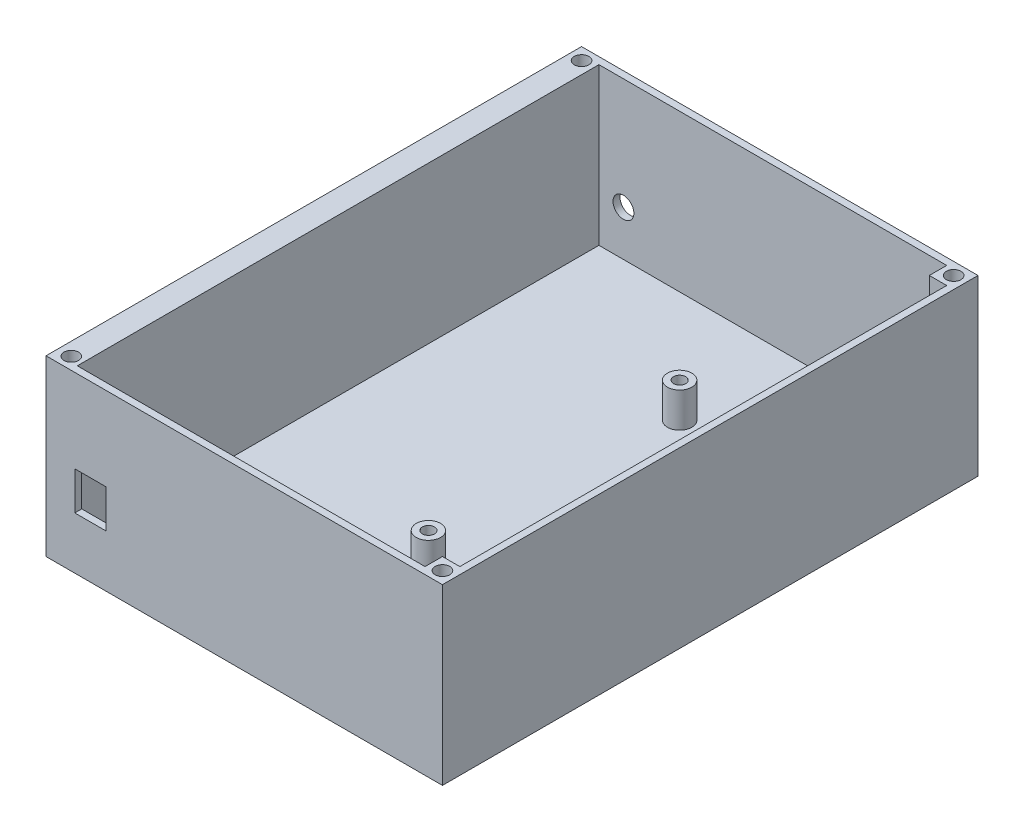
ISO-10303-21;
HEADER;
FILE_DESCRIPTION(('STEP AP214'),'2;1');
FILE_NAME('part.step','',(''),(''),'','','');
FILE_SCHEMA(('AUTOMOTIVE_DESIGN { 1 0 10303 214 1 1 1 1 }'));
ENDSEC;
DATA;
#1=APPLICATION_CONTEXT('core data for automotive mechanical design processes');
#2=APPLICATION_PROTOCOL_DEFINITION('international standard','automotive_design',2000,#1);
#3=PRODUCT_CONTEXT('',#1,'mechanical');
#4=PRODUCT('Part','Part','',(#3));
#5=PRODUCT_RELATED_PRODUCT_CATEGORY('part','',(#4));
#6=PRODUCT_DEFINITION_FORMATION('','',#4);
#7=PRODUCT_DEFINITION_CONTEXT('part definition',#1,'design');
#8=PRODUCT_DEFINITION('design','',#6,#7);
#9=PRODUCT_DEFINITION_SHAPE('','',#8);
#10=(LENGTH_UNIT() NAMED_UNIT(*) SI_UNIT(.MILLI.,.METRE.));
#11=(NAMED_UNIT(*) PLANE_ANGLE_UNIT() SI_UNIT($,.RADIAN.));
#12=(NAMED_UNIT(*) SI_UNIT($,.STERADIAN.) SOLID_ANGLE_UNIT());
#13=UNCERTAINTY_MEASURE_WITH_UNIT(LENGTH_MEASURE(1.E-05),#10,'distance_accuracy_value','');
#14=(GEOMETRIC_REPRESENTATION_CONTEXT(3) GLOBAL_UNCERTAINTY_ASSIGNED_CONTEXT((#13)) GLOBAL_UNIT_ASSIGNED_CONTEXT((#10,
#11,#12)) REPRESENTATION_CONTEXT('',''));
#15=CARTESIAN_POINT('',(0.,0.,0.));
#16=DIRECTION('',(0.,0.,1.));
#17=DIRECTION('',(1.,0.,0.));
#18=AXIS2_PLACEMENT_3D('',#15,#16,#17);
#19=CARTESIAN_POINT('',(50.,5.,-75.));
#20=DIRECTION('',(1.,0.,0.));
#21=DIRECTION('',(0.,0.,-1.));
#22=AXIS2_PLACEMENT_3D('',#19,#20,#21);
#23=PLANE('',#22);
#24=DIRECTION('',(0.,0.,-1.));
#25=VECTOR('',#24,1.);
#26=CARTESIAN_POINT('',(50.,5.,-75.));
#27=LINE('',#26,#25);
#28=CARTESIAN_POINT('',(50.,5.,-70.));
#29=VERTEX_POINT('',#28);
#30=CARTESIAN_POINT('',(50.,5.,-75.));
#31=VERTEX_POINT('',#30);
#32=EDGE_CURVE('E337',#29,#31,#27,.T.);
#33=ORIENTED_EDGE('',*,*,#32,.F.);
#34=DIRECTION('',(0.,1.,0.));
#35=VECTOR('',#34,1.);
#36=CARTESIAN_POINT('',(50.,5.,-70.));
#37=LINE('',#36,#35);
#38=CARTESIAN_POINT('',(50.,50.,-70.));
#39=VERTEX_POINT('',#38);
#40=EDGE_CURVE('E254',#29,#39,#37,.T.);
#41=ORIENTED_EDGE('',*,*,#40,.T.);
#42=DIRECTION('',(0.,0.,-1.));
#43=VECTOR('',#42,1.);
#44=CARTESIAN_POINT('',(50.,50.,-75.));
#45=LINE('',#44,#43);
#46=CARTESIAN_POINT('',(50.,50.,-75.));
#47=VERTEX_POINT('',#46);
#48=EDGE_CURVE('E353',#39,#47,#45,.T.);
#49=ORIENTED_EDGE('',*,*,#48,.T.);
#50=DIRECTION('',(0.,1.,0.));
#51=VECTOR('',#50,1.);
#52=CARTESIAN_POINT('',(50.,5.,-75.));
#53=LINE('',#52,#51);
#54=EDGE_CURVE('E365',#31,#47,#53,.T.);
#55=ORIENTED_EDGE('',*,*,#54,.F.);
#56=EDGE_LOOP('',(#33,#41,#49,#55));
#57=FACE_BOUND('',#56,.T.);
#58=ADVANCED_FACE('F41',(#57),#23,.F.);
#59=CARTESIAN_POINT('',(57.,50.,82.));
#60=DIRECTION('',(-1.,0.,0.));
#61=DIRECTION('',(0.,0.,1.));
#62=AXIS2_PLACEMENT_3D('',#59,#60,#61);
#63=PLANE('',#62);
#64=DIRECTION('',(0.,0.,-1.));
#65=VECTOR('',#64,1.);
#66=CARTESIAN_POINT('',(57.,0.,82.));
#67=LINE('',#66,#65);
#68=CARTESIAN_POINT('',(57.,0.,77.));
#69=VERTEX_POINT('',#68);
#70=CARTESIAN_POINT('',(57.,0.,-77.));
#71=VERTEX_POINT('',#70);
#72=EDGE_CURVE('E364',#69,#71,#67,.T.);
#73=ORIENTED_EDGE('',*,*,#72,.T.);
#74=DIRECTION('',(0.,1.,0.));
#75=VECTOR('',#74,1.);
#76=CARTESIAN_POINT('',(57.,0.,-77.));
#77=LINE('',#76,#75);
#78=CARTESIAN_POINT('',(57.,50.,-77.));
#79=VERTEX_POINT('',#78);
#80=EDGE_CURVE('E306',#71,#79,#77,.T.);
#81=ORIENTED_EDGE('',*,*,#80,.T.);
#82=DIRECTION('',(0.,0.,-1.));
#83=VECTOR('',#82,1.);
#84=CARTESIAN_POINT('',(57.,50.,82.));
#85=LINE('',#84,#83);
#86=CARTESIAN_POINT('',(57.,50.,77.));
#87=VERTEX_POINT('',#86);
#88=EDGE_CURVE('E375',#87,#79,#85,.T.);
#89=ORIENTED_EDGE('',*,*,#88,.F.);
#90=DIRECTION('',(0.,1.,0.));
#91=VECTOR('',#90,1.);
#92=CARTESIAN_POINT('',(57.,0.,77.));
#93=LINE('',#92,#91);
#94=EDGE_CURVE('E317',#69,#87,#93,.T.);
#95=ORIENTED_EDGE('',*,*,#94,.F.);
#96=EDGE_LOOP('',(#73,#81,#89,#95));
#97=FACE_BOUND('',#96,.T.);
#98=ADVANCED_FACE('F43',(#97),#63,.F.);
#99=CARTESIAN_POINT('',(-57.,50.,82.));
#100=DIRECTION('',(1.,0.,0.));
#101=DIRECTION('',(0.,0.,-1.));
#102=AXIS2_PLACEMENT_3D('',#99,#100,#101);
#103=PLANE('',#102);
#104=DIRECTION('',(0.,0.,1.));
#105=VECTOR('',#104,1.);
#106=CARTESIAN_POINT('',(-57.,50.,82.));
#107=LINE('',#106,#105);
#108=CARTESIAN_POINT('',(-57.,50.,-77.));
#109=VERTEX_POINT('',#108);
#110=CARTESIAN_POINT('',(-57.,50.,77.));
#111=VERTEX_POINT('',#110);
#112=EDGE_CURVE('E379',#109,#111,#107,.T.);
#113=ORIENTED_EDGE('',*,*,#112,.F.);
#114=DIRECTION('',(0.,1.,0.));
#115=VECTOR('',#114,1.);
#116=CARTESIAN_POINT('',(-57.,0.,-77.));
#117=LINE('',#116,#115);
#118=CARTESIAN_POINT('',(-57.,0.,-77.));
#119=VERTEX_POINT('',#118);
#120=EDGE_CURVE('E303',#119,#109,#117,.T.);
#121=ORIENTED_EDGE('',*,*,#120,.F.);
#122=DIRECTION('',(0.,0.,1.));
#123=VECTOR('',#122,1.);
#124=CARTESIAN_POINT('',(-57.,0.,82.));
#125=LINE('',#124,#123);
#126=CARTESIAN_POINT('',(-57.,0.,77.));
#127=VERTEX_POINT('',#126);
#128=EDGE_CURVE('E380',#119,#127,#125,.T.);
#129=ORIENTED_EDGE('',*,*,#128,.T.);
#130=DIRECTION('',(0.,1.,0.));
#131=VECTOR('',#130,1.);
#132=CARTESIAN_POINT('',(-57.,0.,77.));
#133=LINE('',#132,#131);
#134=EDGE_CURVE('E321',#127,#111,#133,.T.);
#135=ORIENTED_EDGE('',*,*,#134,.T.);
#136=EDGE_LOOP('',(#113,#121,#129,#135));
#137=FACE_BOUND('',#136,.T.);
#138=ADVANCED_FACE('F438',(#137),#103,.F.);
#139=CARTESIAN_POINT('',(0.,50.,0.));
#140=DIRECTION('',(0.,-1.,0.));
#141=DIRECTION('',(0.,0.,-1.));
#142=AXIS2_PLACEMENT_3D('',#139,#140,#141);
#143=PLANE('',#142);
#144=CARTESIAN_POINT('',(53.5,50.,-73.5));
#145=DIRECTION('',(0.,1.,0.));
#146=DIRECTION('',(0.,0.,1.));
#147=AXIS2_PLACEMENT_3D('',#144,#145,#146);
#148=CIRCLE('',#147,2.1);
#149=CARTESIAN_POINT('',(53.5,50.,-71.4));
#150=VERTEX_POINT('',#149);
#151=EDGE_CURVE('E272',#150,#150,#148,.T.);
#152=ORIENTED_EDGE('',*,*,#151,.F.);
#153=EDGE_LOOP('',(#152));
#154=FACE_BOUND('',#153,.T.);
#155=CARTESIAN_POINT('',(-53.5,50.,-73.5));
#156=DIRECTION('',(0.,1.,0.));
#157=DIRECTION('',(0.,0.,1.));
#158=AXIS2_PLACEMENT_3D('',#155,#156,#157);
#159=CIRCLE('',#158,2.1);
#160=CARTESIAN_POINT('',(-53.5,50.,-71.4));
#161=VERTEX_POINT('',#160);
#162=EDGE_CURVE('E258',#161,#161,#159,.T.);
#163=ORIENTED_EDGE('',*,*,#162,.F.);
#164=EDGE_LOOP('',(#163));
#165=FACE_BOUND('',#164,.T.);
#166=CARTESIAN_POINT('',(53.5,50.,73.5));
#167=DIRECTION('',(0.,1.,0.));
#168=DIRECTION('',(0.,0.,1.));
#169=AXIS2_PLACEMENT_3D('',#166,#167,#168);
#170=CIRCLE('',#169,2.1);
#171=CARTESIAN_POINT('',(53.5,50.,75.6));
#172=VERTEX_POINT('',#171);
#173=EDGE_CURVE('E271',#172,#172,#170,.T.);
#174=ORIENTED_EDGE('',*,*,#173,.F.);
#175=EDGE_LOOP('',(#174));
#176=FACE_BOUND('',#175,.T.);
#177=CARTESIAN_POINT('',(-53.2364598083488,50.,73.5));
#178=DIRECTION('',(0.,1.,0.));
#179=DIRECTION('',(0.,0.,1.));
#180=AXIS2_PLACEMENT_3D('',#177,#178,#179);
#181=CIRCLE('',#180,2.1);
#182=CARTESIAN_POINT('',(-53.2364598083488,50.,75.6));
#183=VERTEX_POINT('',#182);
#184=EDGE_CURVE('E287',#183,#183,#181,.T.);
#185=ORIENTED_EDGE('',*,*,#184,.F.);
#186=EDGE_LOOP('',(#185));
#187=FACE_BOUND('',#186,.T.);
#188=ORIENTED_EDGE('',*,*,#48,.F.);
#189=DIRECTION('',(-1.,0.,0.));
#190=VECTOR('',#189,1.);
#191=CARTESIAN_POINT('',(50.,50.,-70.));
#192=LINE('',#191,#190);
#193=CARTESIAN_POINT('',(55.,50.,-70.));
#194=VERTEX_POINT('',#193);
#195=EDGE_CURVE('E237',#194,#39,#192,.T.);
#196=ORIENTED_EDGE('',*,*,#195,.F.);
#197=DIRECTION('',(0.,0.,-1.));
#198=VECTOR('',#197,1.);
#199=CARTESIAN_POINT('',(55.,50.,-70.));
#200=LINE('',#199,#198);
#201=CARTESIAN_POINT('',(55.,50.,70.));
#202=VERTEX_POINT('',#201);
#203=EDGE_CURVE('E248',#202,#194,#200,.T.);
#204=ORIENTED_EDGE('',*,*,#203,.F.);
#205=DIRECTION('',(1.,0.,0.));
#206=VECTOR('',#205,1.);
#207=CARTESIAN_POINT('',(50.,50.,70.));
#208=LINE('',#207,#206);
#209=CARTESIAN_POINT('',(50.,50.,70.));
#210=VERTEX_POINT('',#209);
#211=EDGE_CURVE('E231',#210,#202,#208,.T.);
#212=ORIENTED_EDGE('',*,*,#211,.F.);
#213=CARTESIAN_POINT('',(50.,50.,75.));
#214=VERTEX_POINT('',#213);
#215=EDGE_CURVE('E354',#214,#210,#45,.T.);
#216=ORIENTED_EDGE('',*,*,#215,.F.);
#217=DIRECTION('',(1.,0.,0.));
#218=VECTOR('',#217,1.);
#219=CARTESIAN_POINT('',(50.,50.,75.));
#220=LINE('',#219,#218);
#221=CARTESIAN_POINT('',(-50.,50.,75.));
#222=VERTEX_POINT('',#221);
#223=EDGE_CURVE('E349',#222,#214,#220,.T.);
#224=ORIENTED_EDGE('',*,*,#223,.F.);
#225=DIRECTION('',(0.,0.,1.));
#226=VECTOR('',#225,1.);
#227=CARTESIAN_POINT('',(-50.,50.,-75.));
#228=LINE('',#227,#226);
#229=CARTESIAN_POINT('',(-50.,50.,-75.));
#230=VERTEX_POINT('',#229);
#231=EDGE_CURVE('E325',#230,#222,#228,.T.);
#232=ORIENTED_EDGE('',*,*,#231,.F.);
#233=DIRECTION('',(-1.,0.,0.));
#234=VECTOR('',#233,1.);
#235=CARTESIAN_POINT('',(50.,50.,-75.));
#236=LINE('',#235,#234);
#237=EDGE_CURVE('E333',#47,#230,#236,.T.);
#238=ORIENTED_EDGE('',*,*,#237,.F.);
#239=EDGE_LOOP('',(#188,#196,#204,#212,#216,#224,#232,#238));
#240=FACE_BOUND('',#239,.T.);
#241=ORIENTED_EDGE('',*,*,#88,.T.);
#242=DIRECTION('',(1.,0.,0.));
#243=VECTOR('',#242,1.);
#244=CARTESIAN_POINT('',(-57.,50.,-77.));
#245=LINE('',#244,#243);
#246=EDGE_CURVE('E295',#109,#79,#245,.T.);
#247=ORIENTED_EDGE('',*,*,#246,.F.);
#248=ORIENTED_EDGE('',*,*,#112,.T.);
#249=DIRECTION('',(-1.,0.,0.));
#250=VECTOR('',#249,1.);
#251=CARTESIAN_POINT('',(-57.,50.,77.));
#252=LINE('',#251,#250);
#253=EDGE_CURVE('E310',#87,#111,#252,.T.);
#254=ORIENTED_EDGE('',*,*,#253,.F.);
#255=EDGE_LOOP('',(#241,#247,#248,#254));
#256=FACE_BOUND('',#255,.T.);
#257=ADVANCED_FACE('F433',(#154,#165,#176,#187,#240,#256),#143,.F.);
#258=CARTESIAN_POINT('',(0.,0.,0.));
#259=DIRECTION('',(0.,-1.,0.));
#260=DIRECTION('',(0.,0.,-1.));
#261=AXIS2_PLACEMENT_3D('',#258,#259,#260);
#262=PLANE('',#261);
#263=DIRECTION('',(1.,0.,0.));
#264=VECTOR('',#263,1.);
#265=CARTESIAN_POINT('',(-57.,0.,-77.));
#266=LINE('',#265,#264);
#267=EDGE_CURVE('E299',#119,#71,#266,.T.);
#268=ORIENTED_EDGE('',*,*,#267,.T.);
#269=ORIENTED_EDGE('',*,*,#72,.F.);
#270=DIRECTION('',(-1.,0.,0.));
#271=VECTOR('',#270,1.);
#272=CARTESIAN_POINT('',(-57.,0.,77.));
#273=LINE('',#272,#271);
#274=EDGE_CURVE('E313',#69,#127,#273,.T.);
#275=ORIENTED_EDGE('',*,*,#274,.T.);
#276=ORIENTED_EDGE('',*,*,#128,.F.);
#277=EDGE_LOOP('',(#268,#269,#275,#276));
#278=FACE_BOUND('',#277,.T.);
#279=ADVANCED_FACE('F437',(#278),#262,.T.);
#280=CARTESIAN_POINT('',(-50.,5.,-75.));
#281=DIRECTION('',(-1.,0.,0.));
#282=DIRECTION('',(0.,0.,1.));
#283=AXIS2_PLACEMENT_3D('',#280,#281,#282);
#284=PLANE('',#283);
#285=ORIENTED_EDGE('',*,*,#231,.T.);
#286=DIRECTION('',(0.,1.,0.));
#287=VECTOR('',#286,1.);
#288=CARTESIAN_POINT('',(-50.,5.,75.));
#289=LINE('',#288,#287);
#290=CARTESIAN_POINT('',(-50.,5.,75.));
#291=VERTEX_POINT('',#290);
#292=EDGE_CURVE('E346',#291,#222,#289,.T.);
#293=ORIENTED_EDGE('',*,*,#292,.F.);
#294=DIRECTION('',(0.,0.,1.));
#295=VECTOR('',#294,1.);
#296=CARTESIAN_POINT('',(-50.,5.,-75.));
#297=LINE('',#296,#295);
#298=CARTESIAN_POINT('',(-50.,5.,-75.));
#299=VERTEX_POINT('',#298);
#300=EDGE_CURVE('E328',#299,#291,#297,.T.);
#301=ORIENTED_EDGE('',*,*,#300,.F.);
#302=DIRECTION('',(0.,1.,0.));
#303=VECTOR('',#302,1.);
#304=CARTESIAN_POINT('',(-50.,5.,-75.));
#305=LINE('',#304,#303);
#306=EDGE_CURVE('E361',#299,#230,#305,.T.);
#307=ORIENTED_EDGE('',*,*,#306,.T.);
#308=EDGE_LOOP('',(#285,#293,#301,#307));
#309=FACE_BOUND('',#308,.T.);
#310=ADVANCED_FACE('F403',(#309),#284,.F.);
#311=CARTESIAN_POINT('',(50.,5.,-75.));
#312=DIRECTION('',(0.,0.,-1.));
#313=DIRECTION('',(-1.,0.,0.));
#314=AXIS2_PLACEMENT_3D('',#311,#312,#313);
#315=PLANE('',#314);
#316=CARTESIAN_POINT('',(-42.95,18.,-75.));
#317=DIRECTION('',(0.,0.,1.));
#318=DIRECTION('',(1.,0.,0.));
#319=AXIS2_PLACEMENT_3D('',#316,#317,#318);
#320=CIRCLE('',#319,3.);
#321=CARTESIAN_POINT('',(-39.95,18.,-75.));
#322=VERTEX_POINT('',#321);
#323=EDGE_CURVE('E484',#322,#322,#320,.T.);
#324=ORIENTED_EDGE('',*,*,#323,.F.);
#325=EDGE_LOOP('',(#324));
#326=FACE_BOUND('',#325,.T.);
#327=CARTESIAN_POINT('',(42.25,18.,-75.));
#328=DIRECTION('',(0.,0.,1.));
#329=DIRECTION('',(1.,0.,0.));
#330=AXIS2_PLACEMENT_3D('',#327,#328,#329);
#331=CIRCLE('',#330,3.);
#332=CARTESIAN_POINT('',(45.25,18.,-75.));
#333=VERTEX_POINT('',#332);
#334=EDGE_CURVE('E183',#333,#333,#331,.T.);
#335=ORIENTED_EDGE('',*,*,#334,.F.);
#336=EDGE_LOOP('',(#335));
#337=FACE_BOUND('',#336,.T.);
#338=ORIENTED_EDGE('',*,*,#237,.T.);
#339=ORIENTED_EDGE('',*,*,#306,.F.);
#340=DIRECTION('',(-1.,0.,0.));
#341=VECTOR('',#340,1.);
#342=CARTESIAN_POINT('',(50.,5.,-75.));
#343=LINE('',#342,#341);
#344=EDGE_CURVE('E342',#31,#299,#343,.T.);
#345=ORIENTED_EDGE('',*,*,#344,.F.);
#346=ORIENTED_EDGE('',*,*,#54,.T.);
#347=EDGE_LOOP('',(#338,#339,#345,#346));
#348=FACE_BOUND('',#347,.T.);
#349=ADVANCED_FACE('F431',(#326,#337,#348),#315,.F.);
#350=ORIENTED_EDGE('',*,*,#215,.T.);
#351=DIRECTION('',(0.,1.,0.));
#352=VECTOR('',#351,1.);
#353=CARTESIAN_POINT('',(50.,5.,70.));
#354=LINE('',#353,#352);
#355=CARTESIAN_POINT('',(50.,5.,70.));
#356=VERTEX_POINT('',#355);
#357=EDGE_CURVE('E244',#356,#210,#354,.T.);
#358=ORIENTED_EDGE('',*,*,#357,.F.);
#359=CARTESIAN_POINT('',(50.,5.,75.));
#360=VERTEX_POINT('',#359);
#361=EDGE_CURVE('E338',#360,#356,#27,.T.);
#362=ORIENTED_EDGE('',*,*,#361,.F.);
#363=DIRECTION('',(0.,1.,0.));
#364=VECTOR('',#363,1.);
#365=CARTESIAN_POINT('',(50.,5.,75.));
#366=LINE('',#365,#364);
#367=EDGE_CURVE('E369',#360,#214,#366,.T.);
#368=ORIENTED_EDGE('',*,*,#367,.T.);
#369=EDGE_LOOP('',(#350,#358,#362,#368));
#370=FACE_BOUND('',#369,.T.);
#371=ADVANCED_FACE('F411',(#370),#23,.F.);
#372=CARTESIAN_POINT('',(50.,5.,75.));
#373=DIRECTION('',(0.,0.,1.));
#374=DIRECTION('',(1.,0.,0.));
#375=AXIS2_PLACEMENT_3D('',#372,#373,#374);
#376=PLANE('',#375);
#377=DIRECTION('',(1.,0.,0.));
#378=VECTOR('',#377,1.);
#379=CARTESIAN_POINT('',(-48.7226565716942,26.,75.));
#380=LINE('',#379,#378);
#381=CARTESIAN_POINT('',(-48.7226565716942,26.,75.));
#382=VERTEX_POINT('',#381);
#383=CARTESIAN_POINT('',(-39.7226565716942,26.,75.));
#384=VERTEX_POINT('',#383);
#385=EDGE_CURVE('E192',#382,#384,#380,.T.);
#386=ORIENTED_EDGE('',*,*,#385,.F.);
#387=DIRECTION('',(0.,1.,0.));
#388=VECTOR('',#387,1.);
#389=CARTESIAN_POINT('',(-48.7226565716942,15.,75.));
#390=LINE('',#389,#388);
#391=CARTESIAN_POINT('',(-48.7226565716942,15.,75.));
#392=VERTEX_POINT('',#391);
#393=EDGE_CURVE('E57',#392,#382,#390,.T.);
#394=ORIENTED_EDGE('',*,*,#393,.F.);
#395=DIRECTION('',(-1.,0.,0.));
#396=VECTOR('',#395,1.);
#397=CARTESIAN_POINT('',(-48.7226565716942,15.,75.));
#398=LINE('',#397,#396);
#399=CARTESIAN_POINT('',(-39.7226565716942,15.,75.));
#400=VERTEX_POINT('',#399);
#401=EDGE_CURVE('E176',#400,#392,#398,.T.);
#402=ORIENTED_EDGE('',*,*,#401,.F.);
#403=DIRECTION('',(0.,-1.,0.));
#404=VECTOR('',#403,1.);
#405=CARTESIAN_POINT('',(-39.7226565716942,15.,75.));
#406=LINE('',#405,#404);
#407=EDGE_CURVE('E180',#384,#400,#406,.T.);
#408=ORIENTED_EDGE('',*,*,#407,.F.);
#409=EDGE_LOOP('',(#386,#394,#402,#408));
#410=FACE_BOUND('',#409,.T.);
#411=ORIENTED_EDGE('',*,*,#223,.T.);
#412=ORIENTED_EDGE('',*,*,#367,.F.);
#413=DIRECTION('',(1.,0.,0.));
#414=VECTOR('',#413,1.);
#415=CARTESIAN_POINT('',(50.,5.,75.));
#416=LINE('',#415,#414);
#417=EDGE_CURVE('E332',#291,#360,#416,.T.);
#418=ORIENTED_EDGE('',*,*,#417,.F.);
#419=ORIENTED_EDGE('',*,*,#292,.T.);
#420=EDGE_LOOP('',(#411,#412,#418,#419));
#421=FACE_BOUND('',#420,.T.);
#422=ADVANCED_FACE('F396',(#410,#421),#376,.F.);
#423=CARTESIAN_POINT('',(0.,5.,0.));
#424=DIRECTION('',(0.,-1.,0.));
#425=DIRECTION('',(0.,0.,-1.));
#426=AXIS2_PLACEMENT_3D('',#423,#424,#425);
#427=PLANE('',#426);
#428=CARTESIAN_POINT('',(6.4759805179051,5.,30.5097189676147));
#429=DIRECTION('',(0.,-1.,0.));
#430=DIRECTION('',(0.,0.,-1.));
#431=AXIS2_PLACEMENT_3D('',#428,#429,#430);
#432=CIRCLE('',#431,3.5);
#433=CARTESIAN_POINT('',(6.4759805179051,5.,27.0097189676147));
#434=VERTEX_POINT('',#433);
#435=EDGE_CURVE('E11',#434,#434,#432,.F.);
#436=ORIENTED_EDGE('',*,*,#435,.F.);
#437=EDGE_LOOP('',(#436));
#438=FACE_BOUND('',#437,.T.);
#439=CARTESIAN_POINT('',(5.17288808433136,5.,-43.030985647448));
#440=DIRECTION('',(0.,-1.,0.));
#441=DIRECTION('',(0.,0.,-1.));
#442=AXIS2_PLACEMENT_3D('',#439,#440,#441);
#443=CIRCLE('',#442,3.5);
#444=CARTESIAN_POINT('',(5.17288808433136,5.,-46.530985647448));
#445=VERTEX_POINT('',#444);
#446=EDGE_CURVE('E50',#445,#445,#443,.F.);
#447=ORIENTED_EDGE('',*,*,#446,.F.);
#448=EDGE_LOOP('',(#447));
#449=FACE_BOUND('',#448,.T.);
#450=ORIENTED_EDGE('',*,*,#300,.T.);
#451=ORIENTED_EDGE('',*,*,#417,.T.);
#452=ORIENTED_EDGE('',*,*,#361,.T.);
#453=DIRECTION('',(1.,0.,0.));
#454=VECTOR('',#453,1.);
#455=CARTESIAN_POINT('',(50.,5.,70.));
#456=LINE('',#455,#454);
#457=CARTESIAN_POINT('',(55.,5.,70.));
#458=VERTEX_POINT('',#457);
#459=EDGE_CURVE('E232',#356,#458,#456,.T.);
#460=ORIENTED_EDGE('',*,*,#459,.T.);
#461=DIRECTION('',(0.,0.,-1.));
#462=VECTOR('',#461,1.);
#463=CARTESIAN_POINT('',(55.,5.,-70.));
#464=LINE('',#463,#462);
#465=CARTESIAN_POINT('',(55.,5.,-70.));
#466=VERTEX_POINT('',#465);
#467=EDGE_CURVE('E236',#458,#466,#464,.T.);
#468=ORIENTED_EDGE('',*,*,#467,.T.);
#469=DIRECTION('',(-1.,0.,0.));
#470=VECTOR('',#469,1.);
#471=CARTESIAN_POINT('',(50.,5.,-70.));
#472=LINE('',#471,#470);
#473=EDGE_CURVE('E241',#466,#29,#472,.T.);
#474=ORIENTED_EDGE('',*,*,#473,.T.);
#475=ORIENTED_EDGE('',*,*,#32,.T.);
#476=ORIENTED_EDGE('',*,*,#344,.T.);
#477=EDGE_LOOP('',(#450,#451,#452,#460,#468,#474,#475,#476));
#478=FACE_BOUND('',#477,.T.);
#479=ADVANCED_FACE('F393',(#438,#449,#478),#427,.F.);
#480=CARTESIAN_POINT('',(-57.,0.,77.));
#481=DIRECTION('',(0.,0.,-1.));
#482=DIRECTION('',(-1.,0.,0.));
#483=AXIS2_PLACEMENT_3D('',#480,#481,#482);
#484=PLANE('',#483);
#485=DIRECTION('',(-1.,0.,0.));
#486=VECTOR('',#485,1.);
#487=CARTESIAN_POINT('',(-48.7226565716942,15.,77.));
#488=LINE('',#487,#486);
#489=CARTESIAN_POINT('',(-39.7226565716942,15.,77.));
#490=VERTEX_POINT('',#489);
#491=CARTESIAN_POINT('',(-48.7226565716942,15.,77.));
#492=VERTEX_POINT('',#491);
#493=EDGE_CURVE('E164',#490,#492,#488,.T.);
#494=ORIENTED_EDGE('',*,*,#493,.T.);
#495=DIRECTION('',(0.,1.,0.));
#496=VECTOR('',#495,1.);
#497=CARTESIAN_POINT('',(-48.7226565716942,15.,77.));
#498=LINE('',#497,#496);
#499=CARTESIAN_POINT('',(-48.7226565716942,26.,77.));
#500=VERTEX_POINT('',#499);
#501=EDGE_CURVE('E157',#492,#500,#498,.T.);
#502=ORIENTED_EDGE('',*,*,#501,.T.);
#503=DIRECTION('',(1.,0.,0.));
#504=VECTOR('',#503,1.);
#505=CARTESIAN_POINT('',(-48.7226565716942,26.,77.));
#506=LINE('',#505,#504);
#507=CARTESIAN_POINT('',(-39.7226565716942,26.,77.));
#508=VERTEX_POINT('',#507);
#509=EDGE_CURVE('E167',#500,#508,#506,.T.);
#510=ORIENTED_EDGE('',*,*,#509,.T.);
#511=DIRECTION('',(0.,-1.,0.));
#512=VECTOR('',#511,1.);
#513=CARTESIAN_POINT('',(-39.7226565716942,15.,77.));
#514=LINE('',#513,#512);
#515=EDGE_CURVE('E65',#508,#490,#514,.T.);
#516=ORIENTED_EDGE('',*,*,#515,.T.);
#517=EDGE_LOOP('',(#494,#502,#510,#516));
#518=FACE_BOUND('',#517,.T.);
#519=ORIENTED_EDGE('',*,*,#253,.T.);
#520=ORIENTED_EDGE('',*,*,#134,.F.);
#521=ORIENTED_EDGE('',*,*,#274,.F.);
#522=ORIENTED_EDGE('',*,*,#94,.T.);
#523=EDGE_LOOP('',(#519,#520,#521,#522));
#524=FACE_BOUND('',#523,.T.);
#525=ADVANCED_FACE('F172',(#518,#524),#484,.F.);
#526=CARTESIAN_POINT('',(-57.,0.,-77.));
#527=DIRECTION('',(0.,0.,1.));
#528=DIRECTION('',(1.,0.,0.));
#529=AXIS2_PLACEMENT_3D('',#526,#527,#528);
#530=PLANE('',#529);
#531=CARTESIAN_POINT('',(-42.95,18.,-77.));
#532=DIRECTION('',(0.,0.,1.));
#533=DIRECTION('',(1.,0.,0.));
#534=AXIS2_PLACEMENT_3D('',#531,#532,#533);
#535=CIRCLE('',#534,3.);
#536=CARTESIAN_POINT('',(-39.95,18.,-77.));
#537=VERTEX_POINT('',#536);
#538=EDGE_CURVE('E489',#537,#537,#535,.T.);
#539=ORIENTED_EDGE('',*,*,#538,.T.);
#540=EDGE_LOOP('',(#539));
#541=FACE_BOUND('',#540,.T.);
#542=CARTESIAN_POINT('',(42.25,18.,-77.));
#543=DIRECTION('',(0.,0.,1.));
#544=DIRECTION('',(1.,0.,0.));
#545=AXIS2_PLACEMENT_3D('',#542,#543,#544);
#546=CIRCLE('',#545,3.);
#547=CARTESIAN_POINT('',(45.25,18.,-77.));
#548=VERTEX_POINT('',#547);
#549=EDGE_CURVE('E193',#548,#548,#546,.T.);
#550=ORIENTED_EDGE('',*,*,#549,.T.);
#551=EDGE_LOOP('',(#550));
#552=FACE_BOUND('',#551,.T.);
#553=ORIENTED_EDGE('',*,*,#246,.T.);
#554=ORIENTED_EDGE('',*,*,#80,.F.);
#555=ORIENTED_EDGE('',*,*,#267,.F.);
#556=ORIENTED_EDGE('',*,*,#120,.T.);
#557=EDGE_LOOP('',(#553,#554,#555,#556));
#558=FACE_BOUND('',#557,.T.);
#559=ADVANCED_FACE('F449',(#541,#552,#558),#530,.F.);
#560=CARTESIAN_POINT('',(-53.2364598083488,30.,73.5));
#561=DIRECTION('',(0.,1.,0.));
#562=DIRECTION('',(0.,0.,1.));
#563=AXIS2_PLACEMENT_3D('',#560,#561,#562);
#564=CYLINDRICAL_SURFACE('',#563,2.1);
#565=CARTESIAN_POINT('',(-53.2364598083488,30.,73.5));
#566=DIRECTION('',(0.,1.,0.));
#567=DIRECTION('',(0.,0.,1.));
#568=AXIS2_PLACEMENT_3D('',#565,#566,#567);
#569=CIRCLE('',#568,2.1);
#570=CARTESIAN_POINT('',(-53.2364598083488,30.,75.6));
#571=VERTEX_POINT('',#570);
#572=EDGE_CURVE('E291',#571,#571,#569,.T.);
#573=ORIENTED_EDGE('',*,*,#572,.F.);
#574=EDGE_LOOP('',(#573));
#575=FACE_BOUND('',#574,.T.);
#576=ORIENTED_EDGE('',*,*,#184,.T.);
#577=EDGE_LOOP('',(#576));
#578=FACE_BOUND('',#577,.T.);
#579=ADVANCED_FACE('F460',(#575,#578),#564,.F.);
#580=CARTESIAN_POINT('',(-53.2364598083488,30.,73.5));
#581=DIRECTION('',(0.,1.,0.));
#582=DIRECTION('',(0.,0.,1.));
#583=AXIS2_PLACEMENT_3D('',#580,#581,#582);
#584=PLANE('',#583);
#585=ORIENTED_EDGE('',*,*,#572,.T.);
#586=EDGE_LOOP('',(#585));
#587=FACE_BOUND('',#586,.T.);
#588=ADVANCED_FACE('F581',(#587),#584,.T.);
#589=CARTESIAN_POINT('',(53.5,30.,73.5));
#590=DIRECTION('',(0.,1.,0.));
#591=DIRECTION('',(0.,0.,1.));
#592=AXIS2_PLACEMENT_3D('',#589,#590,#591);
#593=CYLINDRICAL_SURFACE('',#592,2.1);
#594=CARTESIAN_POINT('',(53.5,30.,73.5));
#595=DIRECTION('',(0.,1.,0.));
#596=DIRECTION('',(0.,0.,1.));
#597=AXIS2_PLACEMENT_3D('',#594,#595,#596);
#598=CIRCLE('',#597,2.1);
#599=CARTESIAN_POINT('',(53.5,30.,75.6));
#600=VERTEX_POINT('',#599);
#601=EDGE_CURVE('E283',#600,#600,#598,.T.);
#602=ORIENTED_EDGE('',*,*,#601,.F.);
#603=EDGE_LOOP('',(#602));
#604=FACE_BOUND('',#603,.T.);
#605=ORIENTED_EDGE('',*,*,#173,.T.);
#606=EDGE_LOOP('',(#605));
#607=FACE_BOUND('',#606,.T.);
#608=ADVANCED_FACE('F577',(#604,#607),#593,.F.);
#609=CARTESIAN_POINT('',(53.5,30.,73.5));
#610=DIRECTION('',(0.,1.,0.));
#611=DIRECTION('',(0.,0.,1.));
#612=AXIS2_PLACEMENT_3D('',#609,#610,#611);
#613=PLANE('',#612);
#614=ORIENTED_EDGE('',*,*,#601,.T.);
#615=EDGE_LOOP('',(#614));
#616=FACE_BOUND('',#615,.T.);
#617=ADVANCED_FACE('F573',(#616),#613,.T.);
#618=CARTESIAN_POINT('',(-53.5,30.,-73.5));
#619=DIRECTION('',(0.,1.,0.));
#620=DIRECTION('',(0.,0.,1.));
#621=AXIS2_PLACEMENT_3D('',#618,#619,#620);
#622=CYLINDRICAL_SURFACE('',#621,2.1);
#623=CARTESIAN_POINT('',(-53.5,30.,-73.5));
#624=DIRECTION('',(0.,1.,0.));
#625=DIRECTION('',(0.,0.,1.));
#626=AXIS2_PLACEMENT_3D('',#623,#624,#625);
#627=CIRCLE('',#626,2.1);
#628=CARTESIAN_POINT('',(-53.5,30.,-71.4));
#629=VERTEX_POINT('',#628);
#630=EDGE_CURVE('E276',#629,#629,#627,.T.);
#631=ORIENTED_EDGE('',*,*,#630,.F.);
#632=EDGE_LOOP('',(#631));
#633=FACE_BOUND('',#632,.T.);
#634=ORIENTED_EDGE('',*,*,#162,.T.);
#635=EDGE_LOOP('',(#634));
#636=FACE_BOUND('',#635,.T.);
#637=ADVANCED_FACE('F569',(#633,#636),#622,.F.);
#638=CARTESIAN_POINT('',(-53.5,30.,-73.5));
#639=DIRECTION('',(0.,1.,0.));
#640=DIRECTION('',(0.,0.,1.));
#641=AXIS2_PLACEMENT_3D('',#638,#639,#640);
#642=PLANE('',#641);
#643=ORIENTED_EDGE('',*,*,#630,.T.);
#644=EDGE_LOOP('',(#643));
#645=FACE_BOUND('',#644,.T.);
#646=ADVANCED_FACE('F565',(#645),#642,.T.);
#647=CARTESIAN_POINT('',(53.5,30.,-73.5));
#648=DIRECTION('',(0.,1.,0.));
#649=DIRECTION('',(0.,0.,1.));
#650=AXIS2_PLACEMENT_3D('',#647,#648,#649);
#651=CYLINDRICAL_SURFACE('',#650,2.1);
#652=CARTESIAN_POINT('',(53.5,30.,-73.5));
#653=DIRECTION('',(0.,1.,0.));
#654=DIRECTION('',(0.,0.,1.));
#655=AXIS2_PLACEMENT_3D('',#652,#653,#654);
#656=CIRCLE('',#655,2.1);
#657=CARTESIAN_POINT('',(53.5,30.,-71.4));
#658=VERTEX_POINT('',#657);
#659=EDGE_CURVE('E267',#658,#658,#656,.T.);
#660=ORIENTED_EDGE('',*,*,#659,.F.);
#661=EDGE_LOOP('',(#660));
#662=FACE_BOUND('',#661,.T.);
#663=ORIENTED_EDGE('',*,*,#151,.T.);
#664=EDGE_LOOP('',(#663));
#665=FACE_BOUND('',#664,.T.);
#666=ADVANCED_FACE('F561',(#662,#665),#651,.F.);
#667=CARTESIAN_POINT('',(53.5,30.,-73.5));
#668=DIRECTION('',(0.,1.,0.));
#669=DIRECTION('',(0.,0.,1.));
#670=AXIS2_PLACEMENT_3D('',#667,#668,#669);
#671=PLANE('',#670);
#672=ORIENTED_EDGE('',*,*,#659,.T.);
#673=EDGE_LOOP('',(#672));
#674=FACE_BOUND('',#673,.T.);
#675=ADVANCED_FACE('F554',(#674),#671,.T.);
#676=CARTESIAN_POINT('',(50.,5.,-70.));
#677=DIRECTION('',(0.,0.,-1.));
#678=DIRECTION('',(-1.,0.,0.));
#679=AXIS2_PLACEMENT_3D('',#676,#677,#678);
#680=PLANE('',#679);
#681=ORIENTED_EDGE('',*,*,#195,.T.);
#682=ORIENTED_EDGE('',*,*,#40,.F.);
#683=ORIENTED_EDGE('',*,*,#473,.F.);
#684=DIRECTION('',(0.,1.,0.));
#685=VECTOR('',#684,1.);
#686=CARTESIAN_POINT('',(55.,5.,-70.));
#687=LINE('',#686,#685);
#688=EDGE_CURVE('E259',#466,#194,#687,.T.);
#689=ORIENTED_EDGE('',*,*,#688,.T.);
#690=EDGE_LOOP('',(#681,#682,#683,#689));
#691=FACE_BOUND('',#690,.T.);
#692=ADVANCED_FACE('F422',(#691),#680,.F.);
#693=CARTESIAN_POINT('',(55.,5.,-70.));
#694=DIRECTION('',(1.,0.,0.));
#695=DIRECTION('',(0.,0.,-1.));
#696=AXIS2_PLACEMENT_3D('',#693,#694,#695);
#697=PLANE('',#696);
#698=ORIENTED_EDGE('',*,*,#203,.T.);
#699=ORIENTED_EDGE('',*,*,#688,.F.);
#700=ORIENTED_EDGE('',*,*,#467,.F.);
#701=DIRECTION('',(0.,1.,0.));
#702=VECTOR('',#701,1.);
#703=CARTESIAN_POINT('',(55.,5.,70.));
#704=LINE('',#703,#702);
#705=EDGE_CURVE('E262',#458,#202,#704,.T.);
#706=ORIENTED_EDGE('',*,*,#705,.T.);
#707=EDGE_LOOP('',(#698,#699,#700,#706));
#708=FACE_BOUND('',#707,.T.);
#709=ADVANCED_FACE('F419',(#708),#697,.F.);
#710=CARTESIAN_POINT('',(50.,5.,70.));
#711=DIRECTION('',(0.,0.,1.));
#712=DIRECTION('',(1.,0.,0.));
#713=AXIS2_PLACEMENT_3D('',#710,#711,#712);
#714=PLANE('',#713);
#715=ORIENTED_EDGE('',*,*,#211,.T.);
#716=ORIENTED_EDGE('',*,*,#705,.F.);
#717=ORIENTED_EDGE('',*,*,#459,.F.);
#718=ORIENTED_EDGE('',*,*,#357,.T.);
#719=EDGE_LOOP('',(#715,#716,#717,#718));
#720=FACE_BOUND('',#719,.T.);
#721=ADVANCED_FACE('F415',(#720),#714,.F.);
#722=CARTESIAN_POINT('',(5.17288808433136,15.,-43.030985647448));
#723=DIRECTION('',(0.,-1.,0.));
#724=DIRECTION('',(0.,0.,-1.));
#725=AXIS2_PLACEMENT_3D('',#722,#723,#724);
#726=CYLINDRICAL_SURFACE('',#725,3.5);
#727=CARTESIAN_POINT('',(5.17288808433136,15.,-43.030985647448));
#728=DIRECTION('',(0.,1.,0.));
#729=DIRECTION('',(0.,0.,1.));
#730=AXIS2_PLACEMENT_3D('',#727,#728,#729);
#731=CIRCLE('',#730,3.5);
#732=CARTESIAN_POINT('',(5.17288808433136,15.,-39.530985647448));
#733=VERTEX_POINT('',#732);
#734=EDGE_CURVE('E227',#733,#733,#731,.T.);
#735=ORIENTED_EDGE('',*,*,#734,.F.);
#736=EDGE_LOOP('',(#735));
#737=FACE_BOUND('',#736,.T.);
#738=ORIENTED_EDGE('',*,*,#446,.T.);
#739=EDGE_LOOP('',(#738));
#740=FACE_BOUND('',#739,.T.);
#741=ADVANCED_FACE('F391',(#737,#740),#726,.T.);
#742=CARTESIAN_POINT('',(5.17288808433136,15.,-43.030985647448));
#743=DIRECTION('',(0.,1.,0.));
#744=DIRECTION('',(0.,0.,1.));
#745=AXIS2_PLACEMENT_3D('',#742,#743,#744);
#746=PLANE('',#745);
#747=CARTESIAN_POINT('',(5.17288808433136,15.,-43.030985647448));
#748=DIRECTION('',(0.,1.,0.));
#749=DIRECTION('',(0.,0.,1.));
#750=AXIS2_PLACEMENT_3D('',#747,#748,#749);
#751=CIRCLE('',#750,1.75);
#752=CARTESIAN_POINT('',(5.17288808433136,15.,-41.280985647448));
#753=VERTEX_POINT('',#752);
#754=EDGE_CURVE('E212',#753,#753,#751,.T.);
#755=ORIENTED_EDGE('',*,*,#754,.F.);
#756=EDGE_LOOP('',(#755));
#757=FACE_BOUND('',#756,.T.);
#758=ORIENTED_EDGE('',*,*,#734,.T.);
#759=EDGE_LOOP('',(#758));
#760=FACE_BOUND('',#759,.T.);
#761=ADVANCED_FACE('F544',(#757,#760),#746,.T.);
#762=CARTESIAN_POINT('',(6.4759805179051,15.,30.5097189676147));
#763=DIRECTION('',(0.,-1.,0.));
#764=DIRECTION('',(0.,0.,-1.));
#765=AXIS2_PLACEMENT_3D('',#762,#763,#764);
#766=CYLINDRICAL_SURFACE('',#765,3.5);
#767=CARTESIAN_POINT('',(6.4759805179051,15.,30.5097189676147));
#768=DIRECTION('',(0.,1.,0.));
#769=DIRECTION('',(0.,0.,1.));
#770=AXIS2_PLACEMENT_3D('',#767,#768,#769);
#771=CIRCLE('',#770,3.5);
#772=CARTESIAN_POINT('',(6.4759805179051,15.,34.0097189676147));
#773=VERTEX_POINT('',#772);
#774=EDGE_CURVE('E220',#773,#773,#771,.T.);
#775=ORIENTED_EDGE('',*,*,#774,.F.);
#776=EDGE_LOOP('',(#775));
#777=FACE_BOUND('',#776,.T.);
#778=ORIENTED_EDGE('',*,*,#435,.T.);
#779=EDGE_LOOP('',(#778));
#780=FACE_BOUND('',#779,.T.);
#781=ADVANCED_FACE('F540',(#777,#780),#766,.T.);
#782=CARTESIAN_POINT('',(6.4759805179051,15.,30.5097189676147));
#783=DIRECTION('',(0.,1.,0.));
#784=DIRECTION('',(0.,0.,1.));
#785=AXIS2_PLACEMENT_3D('',#782,#783,#784);
#786=PLANE('',#785);
#787=CARTESIAN_POINT('',(6.4759805179051,15.,30.5097189676147));
#788=DIRECTION('',(0.,1.,0.));
#789=DIRECTION('',(0.,0.,1.));
#790=AXIS2_PLACEMENT_3D('',#787,#788,#789);
#791=CIRCLE('',#790,1.75);
#792=CARTESIAN_POINT('',(6.4759805179051,15.,32.2597189676147));
#793=VERTEX_POINT('',#792);
#794=EDGE_CURVE('E202',#793,#793,#791,.T.);
#795=ORIENTED_EDGE('',*,*,#794,.F.);
#796=EDGE_LOOP('',(#795));
#797=FACE_BOUND('',#796,.T.);
#798=ORIENTED_EDGE('',*,*,#774,.T.);
#799=EDGE_LOOP('',(#798));
#800=FACE_BOUND('',#799,.T.);
#801=ADVANCED_FACE('F536',(#797,#800),#786,.T.);
#802=CARTESIAN_POINT('',(5.17288808433136,7.,-43.030985647448));
#803=DIRECTION('',(0.,1.,0.));
#804=DIRECTION('',(0.,0.,1.));
#805=AXIS2_PLACEMENT_3D('',#802,#803,#804);
#806=CYLINDRICAL_SURFACE('',#805,1.75);
#807=CARTESIAN_POINT('',(5.17288808433136,7.,-43.030985647448));
#808=DIRECTION('',(0.,1.,0.));
#809=DIRECTION('',(0.,0.,1.));
#810=AXIS2_PLACEMENT_3D('',#807,#808,#809);
#811=CIRCLE('',#810,1.75);
#812=CARTESIAN_POINT('',(5.17288808433136,7.,-41.280985647448));
#813=VERTEX_POINT('',#812);
#814=EDGE_CURVE('E216',#813,#813,#811,.T.);
#815=ORIENTED_EDGE('',*,*,#814,.F.);
#816=EDGE_LOOP('',(#815));
#817=FACE_BOUND('',#816,.T.);
#818=ORIENTED_EDGE('',*,*,#754,.T.);
#819=EDGE_LOOP('',(#818));
#820=FACE_BOUND('',#819,.T.);
#821=ADVANCED_FACE('F532',(#817,#820),#806,.F.);
#822=CARTESIAN_POINT('',(5.17288808433136,7.,-43.030985647448));
#823=DIRECTION('',(0.,1.,0.));
#824=DIRECTION('',(0.,0.,1.));
#825=AXIS2_PLACEMENT_3D('',#822,#823,#824);
#826=PLANE('',#825);
#827=ORIENTED_EDGE('',*,*,#814,.T.);
#828=EDGE_LOOP('',(#827));
#829=FACE_BOUND('',#828,.T.);
#830=ADVANCED_FACE('F528',(#829),#826,.T.);
#831=CARTESIAN_POINT('',(6.4759805179051,7.,30.5097189676147));
#832=DIRECTION('',(0.,1.,0.));
#833=DIRECTION('',(0.,0.,1.));
#834=AXIS2_PLACEMENT_3D('',#831,#832,#833);
#835=CYLINDRICAL_SURFACE('',#834,1.75);
#836=CARTESIAN_POINT('',(6.4759805179051,7.,30.5097189676147));
#837=DIRECTION('',(0.,1.,0.));
#838=DIRECTION('',(0.,0.,1.));
#839=AXIS2_PLACEMENT_3D('',#836,#837,#838);
#840=CIRCLE('',#839,1.75);
#841=CARTESIAN_POINT('',(6.4759805179051,7.,32.2597189676147));
#842=VERTEX_POINT('',#841);
#843=EDGE_CURVE('E208',#842,#842,#840,.T.);
#844=ORIENTED_EDGE('',*,*,#843,.F.);
#845=EDGE_LOOP('',(#844));
#846=FACE_BOUND('',#845,.T.);
#847=ORIENTED_EDGE('',*,*,#794,.T.);
#848=EDGE_LOOP('',(#847));
#849=FACE_BOUND('',#848,.T.);
#850=ADVANCED_FACE('F524',(#846,#849),#835,.F.);
#851=CARTESIAN_POINT('',(6.4759805179051,7.,30.5097189676147));
#852=DIRECTION('',(0.,1.,0.));
#853=DIRECTION('',(0.,0.,1.));
#854=AXIS2_PLACEMENT_3D('',#851,#852,#853);
#855=PLANE('',#854);
#856=ORIENTED_EDGE('',*,*,#843,.T.);
#857=EDGE_LOOP('',(#856));
#858=FACE_BOUND('',#857,.T.);
#859=ADVANCED_FACE('F521',(#858),#855,.T.);
#860=CARTESIAN_POINT('',(-48.7226565716942,15.,77.));
#861=DIRECTION('',(-1.,0.,0.));
#862=DIRECTION('',(0.,0.,1.));
#863=AXIS2_PLACEMENT_3D('',#860,#861,#862);
#864=PLANE('',#863);
#865=ORIENTED_EDGE('',*,*,#393,.T.);
#866=DIRECTION('',(0.,0.,-1.));
#867=VECTOR('',#866,1.);
#868=CARTESIAN_POINT('',(-48.7226565716942,26.,77.));
#869=LINE('',#868,#867);
#870=EDGE_CURVE('E153',#500,#382,#869,.T.);
#871=ORIENTED_EDGE('',*,*,#870,.F.);
#872=ORIENTED_EDGE('',*,*,#501,.F.);
#873=DIRECTION('',(0.,0.,-1.));
#874=VECTOR('',#873,1.);
#875=CARTESIAN_POINT('',(-48.7226565716942,15.,77.));
#876=LINE('',#875,#874);
#877=EDGE_CURVE('E199',#492,#392,#876,.T.);
#878=ORIENTED_EDGE('',*,*,#877,.T.);
#879=EDGE_LOOP('',(#865,#871,#872,#878));
#880=FACE_BOUND('',#879,.T.);
#881=ADVANCED_FACE('F155',(#880),#864,.F.);
#882=CARTESIAN_POINT('',(-48.7226565716942,15.,77.));
#883=DIRECTION('',(0.,-1.,0.));
#884=DIRECTION('',(0.,0.,-1.));
#885=AXIS2_PLACEMENT_3D('',#882,#883,#884);
#886=PLANE('',#885);
#887=ORIENTED_EDGE('',*,*,#401,.T.);
#888=ORIENTED_EDGE('',*,*,#877,.F.);
#889=ORIENTED_EDGE('',*,*,#493,.F.);
#890=DIRECTION('',(0.,0.,-1.));
#891=VECTOR('',#890,1.);
#892=CARTESIAN_POINT('',(-39.7226565716942,15.,77.));
#893=LINE('',#892,#891);
#894=EDGE_CURVE('E203',#490,#400,#893,.T.);
#895=ORIENTED_EDGE('',*,*,#894,.T.);
#896=EDGE_LOOP('',(#887,#888,#889,#895));
#897=FACE_BOUND('',#896,.T.);
#898=ADVANCED_FACE('F510',(#897),#886,.F.);
#899=CARTESIAN_POINT('',(-39.7226565716942,15.,77.));
#900=DIRECTION('',(1.,0.,0.));
#901=DIRECTION('',(0.,0.,-1.));
#902=AXIS2_PLACEMENT_3D('',#899,#900,#901);
#903=PLANE('',#902);
#904=ORIENTED_EDGE('',*,*,#407,.T.);
#905=ORIENTED_EDGE('',*,*,#894,.F.);
#906=ORIENTED_EDGE('',*,*,#515,.F.);
#907=DIRECTION('',(0.,0.,-1.));
#908=VECTOR('',#907,1.);
#909=CARTESIAN_POINT('',(-39.7226565716942,26.,77.));
#910=LINE('',#909,#908);
#911=EDGE_CURVE('E163',#508,#384,#910,.T.);
#912=ORIENTED_EDGE('',*,*,#911,.T.);
#913=EDGE_LOOP('',(#904,#905,#906,#912));
#914=FACE_BOUND('',#913,.T.);
#915=ADVANCED_FACE('F513',(#914),#903,.F.);
#916=CARTESIAN_POINT('',(-48.7226565716942,26.,77.));
#917=DIRECTION('',(0.,1.,0.));
#918=DIRECTION('',(-1.,0.,0.));
#919=AXIS2_PLACEMENT_3D('',#916,#917,#918);
#920=PLANE('',#919);
#921=ORIENTED_EDGE('',*,*,#385,.T.);
#922=ORIENTED_EDGE('',*,*,#911,.F.);
#923=ORIENTED_EDGE('',*,*,#509,.F.);
#924=ORIENTED_EDGE('',*,*,#870,.T.);
#925=EDGE_LOOP('',(#921,#922,#923,#924));
#926=FACE_BOUND('',#925,.T.);
#927=ADVANCED_FACE('F168',(#926),#920,.F.);
#928=CARTESIAN_POINT('',(42.25,18.,-77.));
#929=DIRECTION('',(0.,0.,1.));
#930=DIRECTION('',(1.,0.,0.));
#931=AXIS2_PLACEMENT_3D('',#928,#929,#930);
#932=CYLINDRICAL_SURFACE('',#931,3.);
#933=ORIENTED_EDGE('',*,*,#549,.F.);
#934=EDGE_LOOP('',(#933));
#935=FACE_BOUND('',#934,.T.);
#936=ORIENTED_EDGE('',*,*,#334,.T.);
#937=EDGE_LOOP('',(#936));
#938=FACE_BOUND('',#937,.T.);
#939=ADVANCED_FACE('F501',(#935,#938),#932,.F.);
#940=CARTESIAN_POINT('',(-42.95,18.,-77.));
#941=DIRECTION('',(0.,0.,1.));
#942=DIRECTION('',(1.,0.,0.));
#943=AXIS2_PLACEMENT_3D('',#940,#941,#942);
#944=CYLINDRICAL_SURFACE('',#943,3.);
#945=ORIENTED_EDGE('',*,*,#538,.F.);
#946=EDGE_LOOP('',(#945));
#947=FACE_BOUND('',#946,.T.);
#948=ORIENTED_EDGE('',*,*,#323,.T.);
#949=EDGE_LOOP('',(#948));
#950=FACE_BOUND('',#949,.T.);
#951=ADVANCED_FACE('F499',(#947,#950),#944,.F.);
#952=CLOSED_SHELL('',(#58,#98,#138,#257,#279,#310,#349,#371,#422,#479,#525,#559,#579,#588,#608,
#617,#637,#646,#666,#675,#692,#709,#721,#741,#761,#781,#801,#821,#830,#850,#859,#881,#898,#915,
#927,#939,#951));
#953=MANIFOLD_SOLID_BREP('B2',#952);
#954=ADVANCED_BREP_SHAPE_REPRESENTATION('',(#18,#953),#14);
#955=SHAPE_DEFINITION_REPRESENTATION(#9,#954);
ENDSEC;
END-ISO-10303-21;
